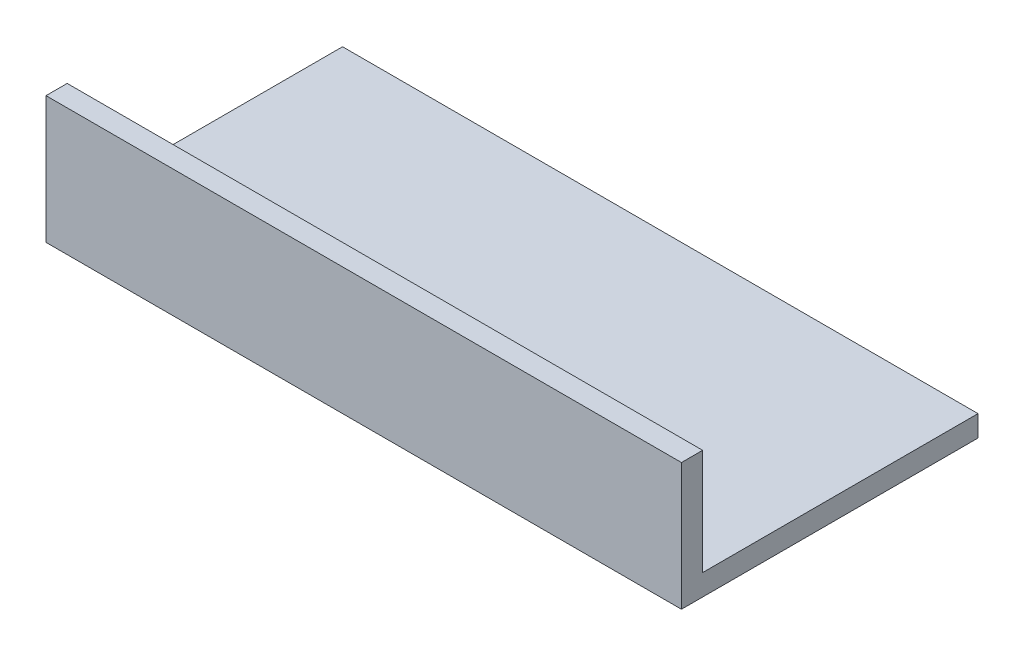
ISO-10303-21;
HEADER;
FILE_DESCRIPTION(('STEP AP214'),'2;1');
FILE_NAME('part.step','',(''),(''),'','','');
FILE_SCHEMA(('AUTOMOTIVE_DESIGN { 1 0 10303 214 1 1 1 1 }'));
ENDSEC;
DATA;
#1=APPLICATION_CONTEXT('core data for automotive mechanical design processes');
#2=APPLICATION_PROTOCOL_DEFINITION('international standard','automotive_design',2000,#1);
#3=PRODUCT_CONTEXT('',#1,'mechanical');
#4=PRODUCT('Part','Part','',(#3));
#5=PRODUCT_RELATED_PRODUCT_CATEGORY('part','',(#4));
#6=PRODUCT_DEFINITION_FORMATION('','',#4);
#7=PRODUCT_DEFINITION_CONTEXT('part definition',#1,'design');
#8=PRODUCT_DEFINITION('design','',#6,#7);
#9=PRODUCT_DEFINITION_SHAPE('','',#8);
#10=(LENGTH_UNIT() NAMED_UNIT(*) SI_UNIT(.MILLI.,.METRE.));
#11=(NAMED_UNIT(*) PLANE_ANGLE_UNIT() SI_UNIT($,.RADIAN.));
#12=(NAMED_UNIT(*) SI_UNIT($,.STERADIAN.) SOLID_ANGLE_UNIT());
#13=UNCERTAINTY_MEASURE_WITH_UNIT(LENGTH_MEASURE(1.E-05),#10,'distance_accuracy_value','');
#14=(GEOMETRIC_REPRESENTATION_CONTEXT(3) GLOBAL_UNCERTAINTY_ASSIGNED_CONTEXT((#13)) GLOBAL_UNIT_ASSIGNED_CONTEXT((#10,
#11,#12)) REPRESENTATION_CONTEXT('',''));
#15=CARTESIAN_POINT('',(0.,0.,0.));
#16=DIRECTION('',(0.,0.,1.));
#17=DIRECTION('',(1.,0.,0.));
#18=AXIS2_PLACEMENT_3D('',#15,#16,#17);
#19=CARTESIAN_POINT('',(75.,12.5,5.));
#20=DIRECTION('',(-1.,0.,0.));
#21=DIRECTION('',(0.,0.,1.));
#22=AXIS2_PLACEMENT_3D('',#19,#20,#21);
#23=PLANE('',#22);
#24=DIRECTION('',(0.,1.,0.));
#25=VECTOR('',#24,1.);
#26=CARTESIAN_POINT('',(75.,12.5,0.));
#27=LINE('',#26,#25);
#28=CARTESIAN_POINT('',(75.,-12.5,0.));
#29=VERTEX_POINT('',#28);
#30=CARTESIAN_POINT('',(75.,12.5,0.));
#31=VERTEX_POINT('',#30);
#32=EDGE_CURVE('E90',#29,#31,#27,.T.);
#33=ORIENTED_EDGE('',*,*,#32,.T.);
#34=DIRECTION('',(0.,0.,-1.));
#35=VECTOR('',#34,1.);
#36=CARTESIAN_POINT('',(75.,12.5,5.));
#37=LINE('',#36,#35);
#38=CARTESIAN_POINT('',(75.,12.5,5.));
#39=VERTEX_POINT('',#38);
#40=EDGE_CURVE('E11',#39,#31,#37,.T.);
#41=ORIENTED_EDGE('',*,*,#40,.F.);
#42=DIRECTION('',(0.,1.,0.));
#43=VECTOR('',#42,1.);
#44=CARTESIAN_POINT('',(75.,12.5,5.));
#45=LINE('',#44,#43);
#46=CARTESIAN_POINT('',(75.,-17.5,5.));
#47=VERTEX_POINT('',#46);
#48=EDGE_CURVE('E95',#47,#39,#45,.T.);
#49=ORIENTED_EDGE('',*,*,#48,.F.);
#50=DIRECTION('',(0.,0.,1.));
#51=VECTOR('',#50,1.);
#52=CARTESIAN_POINT('',(75.,-17.5,5.));
#53=LINE('',#52,#51);
#54=CARTESIAN_POINT('',(75.,-17.5,-65.));
#55=VERTEX_POINT('',#54);
#56=EDGE_CURVE('E134',#55,#47,#53,.T.);
#57=ORIENTED_EDGE('',*,*,#56,.F.);
#58=DIRECTION('',(0.,1.,0.));
#59=VECTOR('',#58,1.);
#60=CARTESIAN_POINT('',(75.,-17.5,-65.));
#61=LINE('',#60,#59);
#62=CARTESIAN_POINT('',(75.,-12.5,-65.));
#63=VERTEX_POINT('',#62);
#64=EDGE_CURVE('E113',#55,#63,#61,.T.);
#65=ORIENTED_EDGE('',*,*,#64,.T.);
#66=DIRECTION('',(0.,0.,1.));
#67=VECTOR('',#66,1.);
#68=CARTESIAN_POINT('',(75.,-12.5,5.));
#69=LINE('',#68,#67);
#70=EDGE_CURVE('E104',#63,#29,#69,.T.);
#71=ORIENTED_EDGE('',*,*,#70,.T.);
#72=EDGE_LOOP('',(#33,#41,#49,#57,#65,#71));
#73=FACE_BOUND('',#72,.T.);
#74=ADVANCED_FACE('F39',(#73),#23,.F.);
#75=CARTESIAN_POINT('',(-75.,12.5,5.));
#76=DIRECTION('',(0.,-1.,0.));
#77=DIRECTION('',(0.,0.,-1.));
#78=AXIS2_PLACEMENT_3D('',#75,#76,#77);
#79=PLANE('',#78);
#80=DIRECTION('',(-1.,0.,0.));
#81=VECTOR('',#80,1.);
#82=CARTESIAN_POINT('',(-75.,12.5,0.));
#83=LINE('',#82,#81);
#84=CARTESIAN_POINT('',(-75.,12.5,0.));
#85=VERTEX_POINT('',#84);
#86=EDGE_CURVE('E67',#31,#85,#83,.T.);
#87=ORIENTED_EDGE('',*,*,#86,.T.);
#88=DIRECTION('',(0.,0.,-1.));
#89=VECTOR('',#88,1.);
#90=CARTESIAN_POINT('',(-75.,12.5,5.));
#91=LINE('',#90,#89);
#92=CARTESIAN_POINT('',(-75.,12.5,5.));
#93=VERTEX_POINT('',#92);
#94=EDGE_CURVE('E48',#93,#85,#91,.T.);
#95=ORIENTED_EDGE('',*,*,#94,.F.);
#96=DIRECTION('',(-1.,0.,0.));
#97=VECTOR('',#96,1.);
#98=CARTESIAN_POINT('',(-75.,12.5,5.));
#99=LINE('',#98,#97);
#100=EDGE_CURVE('E56',#39,#93,#99,.T.);
#101=ORIENTED_EDGE('',*,*,#100,.F.);
#102=ORIENTED_EDGE('',*,*,#40,.T.);
#103=EDGE_LOOP('',(#87,#95,#101,#102));
#104=FACE_BOUND('',#103,.T.);
#105=ADVANCED_FACE('F174',(#104),#79,.F.);
#106=CARTESIAN_POINT('',(-75.,12.5,5.));
#107=DIRECTION('',(1.,0.,0.));
#108=DIRECTION('',(0.,0.,-1.));
#109=AXIS2_PLACEMENT_3D('',#106,#107,#108);
#110=PLANE('',#109);
#111=DIRECTION('',(0.,-1.,0.));
#112=VECTOR('',#111,1.);
#113=CARTESIAN_POINT('',(-75.,12.5,0.));
#114=LINE('',#113,#112);
#115=CARTESIAN_POINT('',(-75.,-12.5,0.));
#116=VERTEX_POINT('',#115);
#117=EDGE_CURVE('E73',#85,#116,#114,.T.);
#118=ORIENTED_EDGE('',*,*,#117,.T.);
#119=DIRECTION('',(0.,0.,-1.));
#120=VECTOR('',#119,1.);
#121=CARTESIAN_POINT('',(-75.,-12.5,5.));
#122=LINE('',#121,#120);
#123=CARTESIAN_POINT('',(-75.,-12.5,-65.));
#124=VERTEX_POINT('',#123);
#125=EDGE_CURVE('E79',#116,#124,#122,.T.);
#126=ORIENTED_EDGE('',*,*,#125,.T.);
#127=DIRECTION('',(0.,1.,0.));
#128=VECTOR('',#127,1.);
#129=CARTESIAN_POINT('',(-75.,-17.5,-65.));
#130=LINE('',#129,#128);
#131=CARTESIAN_POINT('',(-75.,-17.5,-65.));
#132=VERTEX_POINT('',#131);
#133=EDGE_CURVE('E117',#132,#124,#130,.T.);
#134=ORIENTED_EDGE('',*,*,#133,.F.);
#135=DIRECTION('',(0.,0.,-1.));
#136=VECTOR('',#135,1.);
#137=CARTESIAN_POINT('',(-75.,-17.5,5.));
#138=LINE('',#137,#136);
#139=CARTESIAN_POINT('',(-75.,-17.5,5.));
#140=VERTEX_POINT('',#139);
#141=EDGE_CURVE('E112',#140,#132,#138,.T.);
#142=ORIENTED_EDGE('',*,*,#141,.F.);
#143=DIRECTION('',(0.,-1.,0.));
#144=VECTOR('',#143,1.);
#145=CARTESIAN_POINT('',(-75.,12.5,5.));
#146=LINE('',#145,#144);
#147=EDGE_CURVE('E124',#93,#140,#146,.T.);
#148=ORIENTED_EDGE('',*,*,#147,.F.);
#149=ORIENTED_EDGE('',*,*,#94,.T.);
#150=EDGE_LOOP('',(#118,#126,#134,#142,#148,#149));
#151=FACE_BOUND('',#150,.T.);
#152=ADVANCED_FACE('F75',(#151),#110,.F.);
#153=CARTESIAN_POINT('',(0.,0.,5.));
#154=DIRECTION('',(0.,0.,1.));
#155=DIRECTION('',(1.,0.,0.));
#156=AXIS2_PLACEMENT_3D('',#153,#154,#155);
#157=PLANE('',#156);
#158=ORIENTED_EDGE('',*,*,#48,.T.);
#159=ORIENTED_EDGE('',*,*,#100,.T.);
#160=ORIENTED_EDGE('',*,*,#147,.T.);
#161=DIRECTION('',(-1.,0.,0.));
#162=VECTOR('',#161,1.);
#163=CARTESIAN_POINT('',(-75.,-17.5,5.));
#164=LINE('',#163,#162);
#165=EDGE_CURVE('E107',#47,#140,#164,.T.);
#166=ORIENTED_EDGE('',*,*,#165,.F.);
#167=EDGE_LOOP('',(#158,#159,#160,#166));
#168=FACE_BOUND('',#167,.T.);
#169=ADVANCED_FACE('F166',(#168),#157,.T.);
#170=CARTESIAN_POINT('',(0.,0.,0.));
#171=DIRECTION('',(0.,0.,1.));
#172=DIRECTION('',(1.,0.,0.));
#173=AXIS2_PLACEMENT_3D('',#170,#171,#172);
#174=PLANE('',#173);
#175=ORIENTED_EDGE('',*,*,#32,.F.);
#176=DIRECTION('',(1.,0.,0.));
#177=VECTOR('',#176,1.);
#178=CARTESIAN_POINT('',(-75.,-12.5,0.));
#179=LINE('',#178,#177);
#180=EDGE_CURVE('E84',#116,#29,#179,.T.);
#181=ORIENTED_EDGE('',*,*,#180,.F.);
#182=ORIENTED_EDGE('',*,*,#117,.F.);
#183=ORIENTED_EDGE('',*,*,#86,.F.);
#184=EDGE_LOOP('',(#175,#181,#182,#183));
#185=FACE_BOUND('',#184,.T.);
#186=ADVANCED_FACE('F88',(#185),#174,.F.);
#187=CARTESIAN_POINT('',(0.,-12.5,0.));
#188=DIRECTION('',(0.,-1.,0.));
#189=DIRECTION('',(0.,0.,-1.));
#190=AXIS2_PLACEMENT_3D('',#187,#188,#189);
#191=PLANE('',#190);
#192=ORIENTED_EDGE('',*,*,#125,.F.);
#193=ORIENTED_EDGE('',*,*,#180,.T.);
#194=ORIENTED_EDGE('',*,*,#70,.F.);
#195=DIRECTION('',(1.,0.,0.));
#196=VECTOR('',#195,1.);
#197=CARTESIAN_POINT('',(-75.,-12.5,-65.));
#198=LINE('',#197,#196);
#199=EDGE_CURVE('E99',#124,#63,#198,.T.);
#200=ORIENTED_EDGE('',*,*,#199,.F.);
#201=EDGE_LOOP('',(#192,#193,#194,#200));
#202=FACE_BOUND('',#201,.T.);
#203=ADVANCED_FACE('F97',(#202),#191,.F.);
#204=CARTESIAN_POINT('',(-75.,-17.5,-65.));
#205=DIRECTION('',(0.,0.,1.));
#206=DIRECTION('',(1.,0.,0.));
#207=AXIS2_PLACEMENT_3D('',#204,#205,#206);
#208=PLANE('',#207);
#209=ORIENTED_EDGE('',*,*,#199,.T.);
#210=ORIENTED_EDGE('',*,*,#64,.F.);
#211=DIRECTION('',(1.,0.,0.));
#212=VECTOR('',#211,1.);
#213=CARTESIAN_POINT('',(-75.,-17.5,-65.));
#214=LINE('',#213,#212);
#215=EDGE_CURVE('E137',#132,#55,#214,.T.);
#216=ORIENTED_EDGE('',*,*,#215,.F.);
#217=ORIENTED_EDGE('',*,*,#133,.T.);
#218=EDGE_LOOP('',(#209,#210,#216,#217));
#219=FACE_BOUND('',#218,.T.);
#220=ADVANCED_FACE('F155',(#219),#208,.F.);
#221=CARTESIAN_POINT('',(0.,-17.5,0.));
#222=DIRECTION('',(0.,-1.,0.));
#223=DIRECTION('',(0.,0.,-1.));
#224=AXIS2_PLACEMENT_3D('',#221,#222,#223);
#225=PLANE('',#224);
#226=ORIENTED_EDGE('',*,*,#141,.T.);
#227=ORIENTED_EDGE('',*,*,#215,.T.);
#228=ORIENTED_EDGE('',*,*,#56,.T.);
#229=ORIENTED_EDGE('',*,*,#165,.T.);
#230=EDGE_LOOP('',(#226,#227,#228,#229));
#231=FACE_BOUND('',#230,.T.);
#232=ADVANCED_FACE('F146',(#231),#225,.T.);
#233=CLOSED_SHELL('',(#74,#105,#152,#169,#186,#203,#220,#232));
#234=MANIFOLD_SOLID_BREP('B2',#233);
#235=ADVANCED_BREP_SHAPE_REPRESENTATION('',(#18,#234),#14);
#236=SHAPE_DEFINITION_REPRESENTATION(#9,#235);
ENDSEC;
END-ISO-10303-21;
